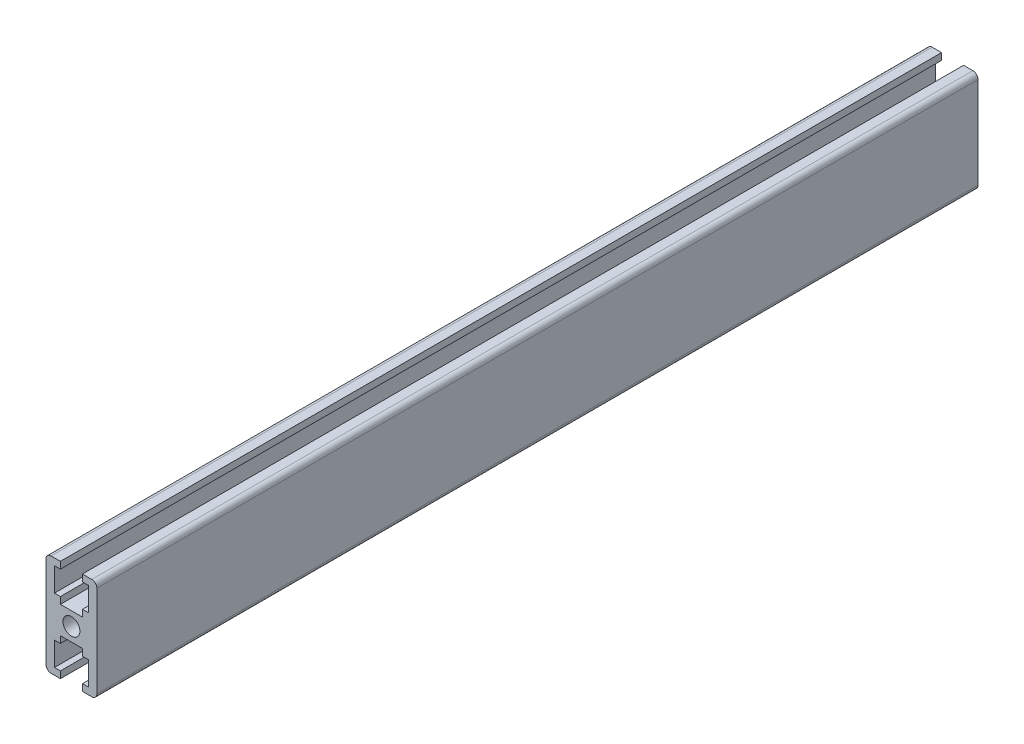
ISO-10303-21;
HEADER;
FILE_DESCRIPTION(('STEP AP214'),'2;1');
FILE_NAME('part.step','',(''),(''),'','','');
FILE_SCHEMA(('AUTOMOTIVE_DESIGN { 1 0 10303 214 1 1 1 1 }'));
ENDSEC;
DATA;
#1=APPLICATION_CONTEXT('core data for automotive mechanical design processes');
#2=APPLICATION_PROTOCOL_DEFINITION('international standard','automotive_design',2000,#1);
#3=PRODUCT_CONTEXT('',#1,'mechanical');
#4=PRODUCT('Part','Part','',(#3));
#5=PRODUCT_RELATED_PRODUCT_CATEGORY('part','',(#4));
#6=PRODUCT_DEFINITION_FORMATION('','',#4);
#7=PRODUCT_DEFINITION_CONTEXT('part definition',#1,'design');
#8=PRODUCT_DEFINITION('design','',#6,#7);
#9=PRODUCT_DEFINITION_SHAPE('','',#8);
#10=(LENGTH_UNIT() NAMED_UNIT(*) SI_UNIT(.MILLI.,.METRE.));
#11=(NAMED_UNIT(*) PLANE_ANGLE_UNIT() SI_UNIT($,.RADIAN.));
#12=(NAMED_UNIT(*) SI_UNIT($,.STERADIAN.) SOLID_ANGLE_UNIT());
#13=UNCERTAINTY_MEASURE_WITH_UNIT(LENGTH_MEASURE(1.E-05),#10,'distance_accuracy_value','');
#14=(GEOMETRIC_REPRESENTATION_CONTEXT(3) GLOBAL_UNCERTAINTY_ASSIGNED_CONTEXT((#13)) GLOBAL_UNIT_ASSIGNED_CONTEXT((#10,
#11,#12)) REPRESENTATION_CONTEXT('',''));
#15=CARTESIAN_POINT('',(0.,0.,0.));
#16=DIRECTION('',(0.,0.,1.));
#17=DIRECTION('',(1.,0.,0.));
#18=AXIS2_PLACEMENT_3D('',#15,#16,#17);
#19=CARTESIAN_POINT('',(6.,13.5,260.));
#20=DIRECTION('',(0.,0.,-1.));
#21=DIRECTION('',(-1.,0.,0.));
#22=AXIS2_PLACEMENT_3D('',#19,#20,#21);
#23=PLANE('',#22);
#24=DIRECTION('',(0.,1.,0.));
#25=VECTOR('',#24,1.);
#26=CARTESIAN_POINT('',(-3.25,15.,260.));
#27=LINE('',#26,#25);
#28=CARTESIAN_POINT('',(-3.25,13.,260.));
#29=VERTEX_POINT('',#28);
#30=CARTESIAN_POINT('',(-3.25,15.,260.));
#31=VERTEX_POINT('',#30);
#32=EDGE_CURVE('E337',#29,#31,#27,.T.);
#33=ORIENTED_EDGE('',*,*,#32,.T.);
#34=DIRECTION('',(-1.,0.,0.));
#35=VECTOR('',#34,1.);
#36=CARTESIAN_POINT('',(-5.99999999999999,15.,260.));
#37=LINE('',#36,#35);
#38=CARTESIAN_POINT('',(-5.99999999999999,15.,260.));
#39=VERTEX_POINT('',#38);
#40=EDGE_CURVE('E165',#31,#39,#37,.T.);
#41=ORIENTED_EDGE('',*,*,#40,.T.);
#42=CARTESIAN_POINT('',(-6.,13.5,260.));
#43=DIRECTION('',(0.,0.,1.));
#44=DIRECTION('',(-1.,0.,0.));
#45=AXIS2_PLACEMENT_3D('',#42,#43,#44);
#46=CIRCLE('',#45,1.5);
#47=CARTESIAN_POINT('',(-7.5,13.5,260.));
#48=VERTEX_POINT('',#47);
#49=EDGE_CURVE('E424',#39,#48,#46,.T.);
#50=ORIENTED_EDGE('',*,*,#49,.T.);
#51=DIRECTION('',(0.,-1.,0.));
#52=VECTOR('',#51,1.);
#53=CARTESIAN_POINT('',(-7.5,-13.5,260.));
#54=LINE('',#53,#52);
#55=CARTESIAN_POINT('',(-7.5,-13.5,260.));
#56=VERTEX_POINT('',#55);
#57=EDGE_CURVE('E443',#48,#56,#54,.T.);
#58=ORIENTED_EDGE('',*,*,#57,.T.);
#59=CARTESIAN_POINT('',(-6.,-13.5,260.));
#60=DIRECTION('',(0.,0.,1.));
#61=DIRECTION('',(-1.,0.,0.));
#62=AXIS2_PLACEMENT_3D('',#59,#60,#61);
#63=CIRCLE('',#62,1.5);
#64=CARTESIAN_POINT('',(-5.99999999999999,-15.,260.));
#65=VERTEX_POINT('',#64);
#66=EDGE_CURVE('E440',#56,#65,#63,.T.);
#67=ORIENTED_EDGE('',*,*,#66,.T.);
#68=DIRECTION('',(1.,0.,0.));
#69=VECTOR('',#68,1.);
#70=CARTESIAN_POINT('',(-5.99999999999999,-15.,260.));
#71=LINE('',#70,#69);
#72=CARTESIAN_POINT('',(-3.25,-15.,260.));
#73=VERTEX_POINT('',#72);
#74=EDGE_CURVE('E442',#65,#73,#71,.T.);
#75=ORIENTED_EDGE('',*,*,#74,.T.);
#76=DIRECTION('',(0.,1.,0.));
#77=VECTOR('',#76,1.);
#78=CARTESIAN_POINT('',(-3.25,-15.,260.));
#79=LINE('',#78,#77);
#80=CARTESIAN_POINT('',(-3.25,-13.,260.));
#81=VERTEX_POINT('',#80);
#82=EDGE_CURVE('E445',#73,#81,#79,.T.);
#83=ORIENTED_EDGE('',*,*,#82,.T.);
#84=DIRECTION('',(-1.,0.,0.));
#85=VECTOR('',#84,1.);
#86=CARTESIAN_POINT('',(-3.25,-13.,260.));
#87=LINE('',#86,#85);
#88=CARTESIAN_POINT('',(-5.,-13.,260.));
#89=VERTEX_POINT('',#88);
#90=EDGE_CURVE('E451',#81,#89,#87,.T.);
#91=ORIENTED_EDGE('',*,*,#90,.T.);
#92=DIRECTION('',(0.,1.,0.));
#93=VECTOR('',#92,1.);
#94=CARTESIAN_POINT('',(-5.,-13.,260.));
#95=LINE('',#94,#93);
#96=CARTESIAN_POINT('',(-5.,-6.,260.));
#97=VERTEX_POINT('',#96);
#98=EDGE_CURVE('E453',#89,#97,#95,.T.);
#99=ORIENTED_EDGE('',*,*,#98,.T.);
#100=DIRECTION('',(1.,0.,0.));
#101=VECTOR('',#100,1.);
#102=CARTESIAN_POINT('',(-5.,-6.,260.));
#103=LINE('',#102,#101);
#104=CARTESIAN_POINT('',(-3.25,-6.,260.));
#105=VERTEX_POINT('',#104);
#106=EDGE_CURVE('E455',#97,#105,#103,.T.);
#107=ORIENTED_EDGE('',*,*,#106,.T.);
#108=DIRECTION('',(0.,1.,0.));
#109=VECTOR('',#108,1.);
#110=CARTESIAN_POINT('',(-3.25,-6.,260.));
#111=LINE('',#110,#109);
#112=CARTESIAN_POINT('',(-3.25,-4.,260.));
#113=VERTEX_POINT('',#112);
#114=EDGE_CURVE('E457',#105,#113,#111,.T.);
#115=ORIENTED_EDGE('',*,*,#114,.T.);
#116=DIRECTION('',(1.,0.,0.));
#117=VECTOR('',#116,1.);
#118=CARTESIAN_POINT('',(-3.25,-4.,260.));
#119=LINE('',#118,#117);
#120=CARTESIAN_POINT('',(3.25,-4.,260.));
#121=VERTEX_POINT('',#120);
#122=EDGE_CURVE('E459',#113,#121,#119,.T.);
#123=ORIENTED_EDGE('',*,*,#122,.T.);
#124=DIRECTION('',(0.,-1.,0.));
#125=VECTOR('',#124,1.);
#126=CARTESIAN_POINT('',(3.25,-6.,260.));
#127=LINE('',#126,#125);
#128=CARTESIAN_POINT('',(3.25,-6.,260.));
#129=VERTEX_POINT('',#128);
#130=EDGE_CURVE('E461',#121,#129,#127,.T.);
#131=ORIENTED_EDGE('',*,*,#130,.T.);
#132=DIRECTION('',(1.,0.,0.));
#133=VECTOR('',#132,1.);
#134=CARTESIAN_POINT('',(5.,-6.,260.));
#135=LINE('',#134,#133);
#136=CARTESIAN_POINT('',(5.,-6.,260.));
#137=VERTEX_POINT('',#136);
#138=EDGE_CURVE('E463',#129,#137,#135,.T.);
#139=ORIENTED_EDGE('',*,*,#138,.T.);
#140=DIRECTION('',(0.,-1.,0.));
#141=VECTOR('',#140,1.);
#142=CARTESIAN_POINT('',(5.,-13.,260.));
#143=LINE('',#142,#141);
#144=CARTESIAN_POINT('',(5.,-13.,260.));
#145=VERTEX_POINT('',#144);
#146=EDGE_CURVE('E465',#137,#145,#143,.T.);
#147=ORIENTED_EDGE('',*,*,#146,.T.);
#148=DIRECTION('',(-1.,0.,0.));
#149=VECTOR('',#148,1.);
#150=CARTESIAN_POINT('',(3.25,-13.,260.));
#151=LINE('',#150,#149);
#152=CARTESIAN_POINT('',(3.25,-13.,260.));
#153=VERTEX_POINT('',#152);
#154=EDGE_CURVE('E467',#145,#153,#151,.T.);
#155=ORIENTED_EDGE('',*,*,#154,.T.);
#156=DIRECTION('',(0.,-1.,0.));
#157=VECTOR('',#156,1.);
#158=CARTESIAN_POINT('',(3.25,-15.,260.));
#159=LINE('',#158,#157);
#160=CARTESIAN_POINT('',(3.25,-15.,260.));
#161=VERTEX_POINT('',#160);
#162=EDGE_CURVE('E469',#153,#161,#159,.T.);
#163=ORIENTED_EDGE('',*,*,#162,.T.);
#164=DIRECTION('',(1.,0.,0.));
#165=VECTOR('',#164,1.);
#166=CARTESIAN_POINT('',(3.25,-15.,260.));
#167=LINE('',#166,#165);
#168=CARTESIAN_POINT('',(5.99999999999999,-15.,260.));
#169=VERTEX_POINT('',#168);
#170=EDGE_CURVE('E471',#161,#169,#167,.T.);
#171=ORIENTED_EDGE('',*,*,#170,.T.);
#172=CARTESIAN_POINT('',(6.,-13.5,260.));
#173=DIRECTION('',(0.,0.,1.));
#174=DIRECTION('',(1.,0.,0.));
#175=AXIS2_PLACEMENT_3D('',#172,#173,#174);
#176=CIRCLE('',#175,1.5);
#177=CARTESIAN_POINT('',(7.5,-13.5,260.));
#178=VERTEX_POINT('',#177);
#179=EDGE_CURVE('E473',#169,#178,#176,.T.);
#180=ORIENTED_EDGE('',*,*,#179,.T.);
#181=DIRECTION('',(0.,1.,0.));
#182=VECTOR('',#181,1.);
#183=CARTESIAN_POINT('',(7.5,-13.5,260.));
#184=LINE('',#183,#182);
#185=CARTESIAN_POINT('',(7.5,13.5,260.));
#186=VERTEX_POINT('',#185);
#187=EDGE_CURVE('E475',#178,#186,#184,.T.);
#188=ORIENTED_EDGE('',*,*,#187,.T.);
#189=CARTESIAN_POINT('',(6.,13.5,260.));
#190=DIRECTION('',(0.,0.,1.));
#191=DIRECTION('',(-1.,0.,0.));
#192=AXIS2_PLACEMENT_3D('',#189,#190,#191);
#193=CIRCLE('',#192,1.5);
#194=CARTESIAN_POINT('',(5.99999999999999,15.,260.));
#195=VERTEX_POINT('',#194);
#196=EDGE_CURVE('E477',#186,#195,#193,.T.);
#197=ORIENTED_EDGE('',*,*,#196,.T.);
#198=DIRECTION('',(-1.,0.,0.));
#199=VECTOR('',#198,1.);
#200=CARTESIAN_POINT('',(3.25,15.,260.));
#201=LINE('',#200,#199);
#202=CARTESIAN_POINT('',(3.25,15.,260.));
#203=VERTEX_POINT('',#202);
#204=EDGE_CURVE('E479',#195,#203,#201,.T.);
#205=ORIENTED_EDGE('',*,*,#204,.T.);
#206=DIRECTION('',(0.,-1.,0.));
#207=VECTOR('',#206,1.);
#208=CARTESIAN_POINT('',(3.25,15.,260.));
#209=LINE('',#208,#207);
#210=CARTESIAN_POINT('',(3.25,13.,260.));
#211=VERTEX_POINT('',#210);
#212=EDGE_CURVE('E481',#203,#211,#209,.T.);
#213=ORIENTED_EDGE('',*,*,#212,.T.);
#214=DIRECTION('',(1.,0.,0.));
#215=VECTOR('',#214,1.);
#216=CARTESIAN_POINT('',(3.25,13.,260.));
#217=LINE('',#216,#215);
#218=CARTESIAN_POINT('',(5.,13.,260.));
#219=VERTEX_POINT('',#218);
#220=EDGE_CURVE('E483',#211,#219,#217,.T.);
#221=ORIENTED_EDGE('',*,*,#220,.T.);
#222=DIRECTION('',(0.,-1.,0.));
#223=VECTOR('',#222,1.);
#224=CARTESIAN_POINT('',(5.,13.,260.));
#225=LINE('',#224,#223);
#226=CARTESIAN_POINT('',(5.,6.,260.));
#227=VERTEX_POINT('',#226);
#228=EDGE_CURVE('E485',#219,#227,#225,.T.);
#229=ORIENTED_EDGE('',*,*,#228,.T.);
#230=DIRECTION('',(-1.,0.,0.));
#231=VECTOR('',#230,1.);
#232=CARTESIAN_POINT('',(5.,6.,260.));
#233=LINE('',#232,#231);
#234=CARTESIAN_POINT('',(3.25,6.,260.));
#235=VERTEX_POINT('',#234);
#236=EDGE_CURVE('E487',#227,#235,#233,.T.);
#237=ORIENTED_EDGE('',*,*,#236,.T.);
#238=DIRECTION('',(0.,-1.,0.));
#239=VECTOR('',#238,1.);
#240=CARTESIAN_POINT('',(3.25,6.,260.));
#241=LINE('',#240,#239);
#242=CARTESIAN_POINT('',(3.25,4.,260.));
#243=VERTEX_POINT('',#242);
#244=EDGE_CURVE('E489',#235,#243,#241,.T.);
#245=ORIENTED_EDGE('',*,*,#244,.T.);
#246=DIRECTION('',(-1.,0.,0.));
#247=VECTOR('',#246,1.);
#248=CARTESIAN_POINT('',(-3.25,4.,260.));
#249=LINE('',#248,#247);
#250=CARTESIAN_POINT('',(-3.25,4.,260.));
#251=VERTEX_POINT('',#250);
#252=EDGE_CURVE('E491',#243,#251,#249,.T.);
#253=ORIENTED_EDGE('',*,*,#252,.T.);
#254=DIRECTION('',(0.,1.,0.));
#255=VECTOR('',#254,1.);
#256=CARTESIAN_POINT('',(-3.25,6.,260.));
#257=LINE('',#256,#255);
#258=CARTESIAN_POINT('',(-3.25,6.,260.));
#259=VERTEX_POINT('',#258);
#260=EDGE_CURVE('E256',#251,#259,#257,.T.);
#261=ORIENTED_EDGE('',*,*,#260,.T.);
#262=DIRECTION('',(-1.,0.,0.));
#263=VECTOR('',#262,1.);
#264=CARTESIAN_POINT('',(-5.,6.,260.));
#265=LINE('',#264,#263);
#266=CARTESIAN_POINT('',(-5.,6.,260.));
#267=VERTEX_POINT('',#266);
#268=EDGE_CURVE('E250',#259,#267,#265,.T.);
#269=ORIENTED_EDGE('',*,*,#268,.T.);
#270=DIRECTION('',(0.,1.,0.));
#271=VECTOR('',#270,1.);
#272=CARTESIAN_POINT('',(-5.,13.,260.));
#273=LINE('',#272,#271);
#274=CARTESIAN_POINT('',(-5.,13.,260.));
#275=VERTEX_POINT('',#274);
#276=EDGE_CURVE('E254',#267,#275,#273,.T.);
#277=ORIENTED_EDGE('',*,*,#276,.T.);
#278=DIRECTION('',(1.,0.,0.));
#279=VECTOR('',#278,1.);
#280=CARTESIAN_POINT('',(-3.25,13.,260.));
#281=LINE('',#280,#279);
#282=EDGE_CURVE('E50',#275,#29,#281,.T.);
#283=ORIENTED_EDGE('',*,*,#282,.T.);
#284=EDGE_LOOP('',(#33,#41,#50,#58,#67,#75,#83,#91,#99,#107,#115,#123,#131,#139,#147,#155,#163,
#171,#180,#188,#197,#205,#213,#221,#229,#237,#245,#253,#261,#269,#277,#283));
#285=FACE_BOUND('',#284,.T.);
#286=CARTESIAN_POINT('',(0.,0.,260.));
#287=DIRECTION('',(0.,0.,1.));
#288=DIRECTION('',(1.,0.,0.));
#289=AXIS2_PLACEMENT_3D('',#286,#287,#288);
#290=CIRCLE('',#289,2.5);
#291=CARTESIAN_POINT('',(2.5,0.,260.));
#292=VERTEX_POINT('',#291);
#293=EDGE_CURVE('E278',#292,#292,#290,.T.);
#294=ORIENTED_EDGE('',*,*,#293,.F.);
#295=EDGE_LOOP('',(#294));
#296=FACE_BOUND('',#295,.T.);
#297=ADVANCED_FACE('F33',(#285,#296),#23,.F.);
#298=CARTESIAN_POINT('',(6.,13.5,0.));
#299=DIRECTION('',(0.,0.,-1.));
#300=DIRECTION('',(-1.,0.,0.));
#301=AXIS2_PLACEMENT_3D('',#298,#299,#300);
#302=PLANE('',#301);
#303=DIRECTION('',(0.,1.,0.));
#304=VECTOR('',#303,1.);
#305=CARTESIAN_POINT('',(-3.25,15.,0.));
#306=LINE('',#305,#304);
#307=CARTESIAN_POINT('',(-3.25,13.,0.));
#308=VERTEX_POINT('',#307);
#309=CARTESIAN_POINT('',(-3.25,15.,0.));
#310=VERTEX_POINT('',#309);
#311=EDGE_CURVE('E274',#308,#310,#306,.T.);
#312=ORIENTED_EDGE('',*,*,#311,.F.);
#313=DIRECTION('',(1.,0.,0.));
#314=VECTOR('',#313,1.);
#315=CARTESIAN_POINT('',(-3.25,13.,0.));
#316=LINE('',#315,#314);
#317=CARTESIAN_POINT('',(-5.,13.,0.));
#318=VERTEX_POINT('',#317);
#319=EDGE_CURVE('E157',#318,#308,#316,.T.);
#320=ORIENTED_EDGE('',*,*,#319,.F.);
#321=DIRECTION('',(0.,1.,0.));
#322=VECTOR('',#321,1.);
#323=CARTESIAN_POINT('',(-5.,13.,0.));
#324=LINE('',#323,#322);
#325=CARTESIAN_POINT('',(-5.,6.,0.));
#326=VERTEX_POINT('',#325);
#327=EDGE_CURVE('E151',#326,#318,#324,.T.);
#328=ORIENTED_EDGE('',*,*,#327,.F.);
#329=DIRECTION('',(-1.,0.,0.));
#330=VECTOR('',#329,1.);
#331=CARTESIAN_POINT('',(-5.,6.,0.));
#332=LINE('',#331,#330);
#333=CARTESIAN_POINT('',(-3.25,6.,0.));
#334=VERTEX_POINT('',#333);
#335=EDGE_CURVE('E264',#334,#326,#332,.T.);
#336=ORIENTED_EDGE('',*,*,#335,.F.);
#337=DIRECTION('',(0.,1.,0.));
#338=VECTOR('',#337,1.);
#339=CARTESIAN_POINT('',(-3.25,6.,0.));
#340=LINE('',#339,#338);
#341=CARTESIAN_POINT('',(-3.25,4.,0.));
#342=VERTEX_POINT('',#341);
#343=EDGE_CURVE('E332',#342,#334,#340,.T.);
#344=ORIENTED_EDGE('',*,*,#343,.F.);
#345=DIRECTION('',(-1.,0.,0.));
#346=VECTOR('',#345,1.);
#347=CARTESIAN_POINT('',(-3.25,4.,0.));
#348=LINE('',#347,#346);
#349=CARTESIAN_POINT('',(3.25,4.,0.));
#350=VERTEX_POINT('',#349);
#351=EDGE_CURVE('E330',#350,#342,#348,.T.);
#352=ORIENTED_EDGE('',*,*,#351,.F.);
#353=DIRECTION('',(0.,-1.,0.));
#354=VECTOR('',#353,1.);
#355=CARTESIAN_POINT('',(3.25,6.,0.));
#356=LINE('',#355,#354);
#357=CARTESIAN_POINT('',(3.25,6.,0.));
#358=VERTEX_POINT('',#357);
#359=EDGE_CURVE('E328',#358,#350,#356,.T.);
#360=ORIENTED_EDGE('',*,*,#359,.F.);
#361=DIRECTION('',(-1.,0.,0.));
#362=VECTOR('',#361,1.);
#363=CARTESIAN_POINT('',(5.,6.,0.));
#364=LINE('',#363,#362);
#365=CARTESIAN_POINT('',(5.,6.,0.));
#366=VERTEX_POINT('',#365);
#367=EDGE_CURVE('E326',#366,#358,#364,.T.);
#368=ORIENTED_EDGE('',*,*,#367,.F.);
#369=DIRECTION('',(0.,-1.,0.));
#370=VECTOR('',#369,1.);
#371=CARTESIAN_POINT('',(5.,13.,0.));
#372=LINE('',#371,#370);
#373=CARTESIAN_POINT('',(5.,13.,0.));
#374=VERTEX_POINT('',#373);
#375=EDGE_CURVE('E324',#374,#366,#372,.T.);
#376=ORIENTED_EDGE('',*,*,#375,.F.);
#377=DIRECTION('',(1.,0.,0.));
#378=VECTOR('',#377,1.);
#379=CARTESIAN_POINT('',(3.25,13.,0.));
#380=LINE('',#379,#378);
#381=CARTESIAN_POINT('',(3.25,13.,0.));
#382=VERTEX_POINT('',#381);
#383=EDGE_CURVE('E322',#382,#374,#380,.T.);
#384=ORIENTED_EDGE('',*,*,#383,.F.);
#385=DIRECTION('',(0.,-1.,0.));
#386=VECTOR('',#385,1.);
#387=CARTESIAN_POINT('',(3.25,15.,0.));
#388=LINE('',#387,#386);
#389=CARTESIAN_POINT('',(3.25,15.,0.));
#390=VERTEX_POINT('',#389);
#391=EDGE_CURVE('E320',#390,#382,#388,.T.);
#392=ORIENTED_EDGE('',*,*,#391,.F.);
#393=DIRECTION('',(-1.,0.,0.));
#394=VECTOR('',#393,1.);
#395=CARTESIAN_POINT('',(3.25,15.,0.));
#396=LINE('',#395,#394);
#397=CARTESIAN_POINT('',(5.99999999999999,15.,0.));
#398=VERTEX_POINT('',#397);
#399=EDGE_CURVE('E318',#398,#390,#396,.T.);
#400=ORIENTED_EDGE('',*,*,#399,.F.);
#401=CARTESIAN_POINT('',(6.,13.5,0.));
#402=DIRECTION('',(0.,0.,1.));
#403=DIRECTION('',(-1.,0.,0.));
#404=AXIS2_PLACEMENT_3D('',#401,#402,#403);
#405=CIRCLE('',#404,1.5);
#406=CARTESIAN_POINT('',(7.5,13.5,0.));
#407=VERTEX_POINT('',#406);
#408=EDGE_CURVE('E316',#407,#398,#405,.T.);
#409=ORIENTED_EDGE('',*,*,#408,.F.);
#410=DIRECTION('',(0.,1.,0.));
#411=VECTOR('',#410,1.);
#412=CARTESIAN_POINT('',(7.5,-13.5,0.));
#413=LINE('',#412,#411);
#414=CARTESIAN_POINT('',(7.5,-13.5,0.));
#415=VERTEX_POINT('',#414);
#416=EDGE_CURVE('E314',#415,#407,#413,.T.);
#417=ORIENTED_EDGE('',*,*,#416,.F.);
#418=CARTESIAN_POINT('',(6.,-13.5,0.));
#419=DIRECTION('',(0.,0.,1.));
#420=DIRECTION('',(1.,0.,0.));
#421=AXIS2_PLACEMENT_3D('',#418,#419,#420);
#422=CIRCLE('',#421,1.5);
#423=CARTESIAN_POINT('',(5.99999999999999,-15.,0.));
#424=VERTEX_POINT('',#423);
#425=EDGE_CURVE('E312',#424,#415,#422,.T.);
#426=ORIENTED_EDGE('',*,*,#425,.F.);
#427=DIRECTION('',(1.,0.,0.));
#428=VECTOR('',#427,1.);
#429=CARTESIAN_POINT('',(3.25,-15.,0.));
#430=LINE('',#429,#428);
#431=CARTESIAN_POINT('',(3.25,-15.,0.));
#432=VERTEX_POINT('',#431);
#433=EDGE_CURVE('E310',#432,#424,#430,.T.);
#434=ORIENTED_EDGE('',*,*,#433,.F.);
#435=DIRECTION('',(0.,-1.,0.));
#436=VECTOR('',#435,1.);
#437=CARTESIAN_POINT('',(3.25,-15.,0.));
#438=LINE('',#437,#436);
#439=CARTESIAN_POINT('',(3.25,-13.,0.));
#440=VERTEX_POINT('',#439);
#441=EDGE_CURVE('E308',#440,#432,#438,.T.);
#442=ORIENTED_EDGE('',*,*,#441,.F.);
#443=DIRECTION('',(-1.,0.,0.));
#444=VECTOR('',#443,1.);
#445=CARTESIAN_POINT('',(3.25,-13.,0.));
#446=LINE('',#445,#444);
#447=CARTESIAN_POINT('',(5.,-13.,0.));
#448=VERTEX_POINT('',#447);
#449=EDGE_CURVE('E306',#448,#440,#446,.T.);
#450=ORIENTED_EDGE('',*,*,#449,.F.);
#451=DIRECTION('',(0.,-1.,0.));
#452=VECTOR('',#451,1.);
#453=CARTESIAN_POINT('',(5.,-13.,0.));
#454=LINE('',#453,#452);
#455=CARTESIAN_POINT('',(5.,-6.,0.));
#456=VERTEX_POINT('',#455);
#457=EDGE_CURVE('E304',#456,#448,#454,.T.);
#458=ORIENTED_EDGE('',*,*,#457,.F.);
#459=DIRECTION('',(1.,0.,0.));
#460=VECTOR('',#459,1.);
#461=CARTESIAN_POINT('',(5.,-6.,0.));
#462=LINE('',#461,#460);
#463=CARTESIAN_POINT('',(3.25,-6.,0.));
#464=VERTEX_POINT('',#463);
#465=EDGE_CURVE('E302',#464,#456,#462,.T.);
#466=ORIENTED_EDGE('',*,*,#465,.F.);
#467=DIRECTION('',(0.,-1.,0.));
#468=VECTOR('',#467,1.);
#469=CARTESIAN_POINT('',(3.25,-6.,0.));
#470=LINE('',#469,#468);
#471=CARTESIAN_POINT('',(3.25,-4.,0.));
#472=VERTEX_POINT('',#471);
#473=EDGE_CURVE('E300',#472,#464,#470,.T.);
#474=ORIENTED_EDGE('',*,*,#473,.F.);
#475=DIRECTION('',(1.,0.,0.));
#476=VECTOR('',#475,1.);
#477=CARTESIAN_POINT('',(-3.25,-4.,0.));
#478=LINE('',#477,#476);
#479=CARTESIAN_POINT('',(-3.25,-4.,0.));
#480=VERTEX_POINT('',#479);
#481=EDGE_CURVE('E298',#480,#472,#478,.T.);
#482=ORIENTED_EDGE('',*,*,#481,.F.);
#483=DIRECTION('',(0.,1.,0.));
#484=VECTOR('',#483,1.);
#485=CARTESIAN_POINT('',(-3.25,-6.,0.));
#486=LINE('',#485,#484);
#487=CARTESIAN_POINT('',(-3.25,-6.,0.));
#488=VERTEX_POINT('',#487);
#489=EDGE_CURVE('E296',#488,#480,#486,.T.);
#490=ORIENTED_EDGE('',*,*,#489,.F.);
#491=DIRECTION('',(1.,0.,0.));
#492=VECTOR('',#491,1.);
#493=CARTESIAN_POINT('',(-5.,-6.,0.));
#494=LINE('',#493,#492);
#495=CARTESIAN_POINT('',(-5.,-6.,0.));
#496=VERTEX_POINT('',#495);
#497=EDGE_CURVE('E294',#496,#488,#494,.T.);
#498=ORIENTED_EDGE('',*,*,#497,.F.);
#499=DIRECTION('',(0.,1.,0.));
#500=VECTOR('',#499,1.);
#501=CARTESIAN_POINT('',(-5.,-13.,0.));
#502=LINE('',#501,#500);
#503=CARTESIAN_POINT('',(-5.,-13.,0.));
#504=VERTEX_POINT('',#503);
#505=EDGE_CURVE('E292',#504,#496,#502,.T.);
#506=ORIENTED_EDGE('',*,*,#505,.F.);
#507=DIRECTION('',(-1.,0.,0.));
#508=VECTOR('',#507,1.);
#509=CARTESIAN_POINT('',(-3.25,-13.,0.));
#510=LINE('',#509,#508);
#511=CARTESIAN_POINT('',(-3.25,-13.,0.));
#512=VERTEX_POINT('',#511);
#513=EDGE_CURVE('E290',#512,#504,#510,.T.);
#514=ORIENTED_EDGE('',*,*,#513,.F.);
#515=DIRECTION('',(0.,1.,0.));
#516=VECTOR('',#515,1.);
#517=CARTESIAN_POINT('',(-3.25,-15.,0.));
#518=LINE('',#517,#516);
#519=CARTESIAN_POINT('',(-3.25,-15.,0.));
#520=VERTEX_POINT('',#519);
#521=EDGE_CURVE('E288',#520,#512,#518,.T.);
#522=ORIENTED_EDGE('',*,*,#521,.F.);
#523=DIRECTION('',(1.,0.,0.));
#524=VECTOR('',#523,1.);
#525=CARTESIAN_POINT('',(-5.99999999999999,-15.,0.));
#526=LINE('',#525,#524);
#527=CARTESIAN_POINT('',(-5.99999999999999,-15.,0.));
#528=VERTEX_POINT('',#527);
#529=EDGE_CURVE('E286',#528,#520,#526,.T.);
#530=ORIENTED_EDGE('',*,*,#529,.F.);
#531=CARTESIAN_POINT('',(-6.,-13.5,0.));
#532=DIRECTION('',(0.,0.,1.));
#533=DIRECTION('',(-1.,0.,0.));
#534=AXIS2_PLACEMENT_3D('',#531,#532,#533);
#535=CIRCLE('',#534,1.5);
#536=CARTESIAN_POINT('',(-7.5,-13.5,0.));
#537=VERTEX_POINT('',#536);
#538=EDGE_CURVE('E284',#537,#528,#535,.T.);
#539=ORIENTED_EDGE('',*,*,#538,.F.);
#540=DIRECTION('',(0.,-1.,0.));
#541=VECTOR('',#540,1.);
#542=CARTESIAN_POINT('',(-7.5,-13.5,0.));
#543=LINE('',#542,#541);
#544=CARTESIAN_POINT('',(-7.5,13.5,0.));
#545=VERTEX_POINT('',#544);
#546=EDGE_CURVE('E282',#545,#537,#543,.T.);
#547=ORIENTED_EDGE('',*,*,#546,.F.);
#548=CARTESIAN_POINT('',(-6.,13.5,0.));
#549=DIRECTION('',(0.,0.,1.));
#550=DIRECTION('',(-1.,0.,0.));
#551=AXIS2_PLACEMENT_3D('',#548,#549,#550);
#552=CIRCLE('',#551,1.5);
#553=CARTESIAN_POINT('',(-5.99999999999999,15.,0.));
#554=VERTEX_POINT('',#553);
#555=EDGE_CURVE('E280',#554,#545,#552,.T.);
#556=ORIENTED_EDGE('',*,*,#555,.F.);
#557=DIRECTION('',(-1.,0.,0.));
#558=VECTOR('',#557,1.);
#559=CARTESIAN_POINT('',(-5.99999999999999,15.,0.));
#560=LINE('',#559,#558);
#561=EDGE_CURVE('E277',#310,#554,#560,.T.);
#562=ORIENTED_EDGE('',*,*,#561,.F.);
#563=EDGE_LOOP('',(#312,#320,#328,#336,#344,#352,#360,#368,#376,#384,#392,#400,#409,#417,#426,
#434,#442,#450,#458,#466,#474,#482,#490,#498,#506,#514,#522,#530,#539,#547,#556,#562));
#564=FACE_BOUND('',#563,.T.);
#565=CARTESIAN_POINT('',(0.,0.,0.));
#566=DIRECTION('',(0.,0.,1.));
#567=DIRECTION('',(1.,0.,0.));
#568=AXIS2_PLACEMENT_3D('',#565,#566,#567);
#569=CIRCLE('',#568,2.5);
#570=CARTESIAN_POINT('',(2.5,0.,0.));
#571=VERTEX_POINT('',#570);
#572=EDGE_CURVE('E896',#571,#571,#569,.T.);
#573=ORIENTED_EDGE('',*,*,#572,.T.);
#574=EDGE_LOOP('',(#573));
#575=FACE_BOUND('',#574,.T.);
#576=ADVANCED_FACE('F428',(#564,#575),#302,.T.);
#577=CARTESIAN_POINT('',(-3.25,15.,260.));
#578=DIRECTION('',(-1.,0.,0.));
#579=DIRECTION('',(0.,-1.,0.));
#580=AXIS2_PLACEMENT_3D('',#577,#578,#579);
#581=PLANE('',#580);
#582=ORIENTED_EDGE('',*,*,#311,.T.);
#583=DIRECTION('',(0.,0.,-1.));
#584=VECTOR('',#583,1.);
#585=CARTESIAN_POINT('',(-3.25,15.,260.));
#586=LINE('',#585,#584);
#587=EDGE_CURVE('E11',#31,#310,#586,.T.);
#588=ORIENTED_EDGE('',*,*,#587,.F.);
#589=ORIENTED_EDGE('',*,*,#32,.F.);
#590=DIRECTION('',(0.,0.,-1.));
#591=VECTOR('',#590,1.);
#592=CARTESIAN_POINT('',(-3.25,13.,260.));
#593=LINE('',#592,#591);
#594=EDGE_CURVE('E270',#29,#308,#593,.T.);
#595=ORIENTED_EDGE('',*,*,#594,.T.);
#596=EDGE_LOOP('',(#582,#588,#589,#595));
#597=FACE_BOUND('',#596,.T.);
#598=ADVANCED_FACE('F35',(#597),#581,.F.);
#599=CARTESIAN_POINT('',(-5.99999999999999,15.,260.));
#600=DIRECTION('',(0.,-1.,0.));
#601=DIRECTION('',(1.,0.,0.));
#602=AXIS2_PLACEMENT_3D('',#599,#600,#601);
#603=PLANE('',#602);
#604=ORIENTED_EDGE('',*,*,#561,.T.);
#605=DIRECTION('',(0.,0.,-1.));
#606=VECTOR('',#605,1.);
#607=CARTESIAN_POINT('',(-5.99999999999999,15.,260.));
#608=LINE('',#607,#606);
#609=EDGE_CURVE('E42',#39,#554,#608,.T.);
#610=ORIENTED_EDGE('',*,*,#609,.F.);
#611=ORIENTED_EDGE('',*,*,#40,.F.);
#612=ORIENTED_EDGE('',*,*,#587,.T.);
#613=EDGE_LOOP('',(#604,#610,#611,#612));
#614=FACE_BOUND('',#613,.T.);
#615=ADVANCED_FACE('F526',(#614),#603,.F.);
#616=CARTESIAN_POINT('',(-6.,13.5,260.));
#617=DIRECTION('',(0.,0.,-1.));
#618=DIRECTION('',(-1.,0.,0.));
#619=AXIS2_PLACEMENT_3D('',#616,#617,#618);
#620=CYLINDRICAL_SURFACE('',#619,1.5);
#621=ORIENTED_EDGE('',*,*,#555,.T.);
#622=DIRECTION('',(0.,0.,-1.));
#623=VECTOR('',#622,1.);
#624=CARTESIAN_POINT('',(-7.5,13.5,260.));
#625=LINE('',#624,#623);
#626=EDGE_CURVE('E416',#48,#545,#625,.T.);
#627=ORIENTED_EDGE('',*,*,#626,.F.);
#628=ORIENTED_EDGE('',*,*,#49,.F.);
#629=ORIENTED_EDGE('',*,*,#609,.T.);
#630=EDGE_LOOP('',(#621,#627,#628,#629));
#631=FACE_BOUND('',#630,.T.);
#632=ADVANCED_FACE('F422',(#631),#620,.T.);
#633=CARTESIAN_POINT('',(-7.5,-13.5,260.));
#634=DIRECTION('',(1.,0.,0.));
#635=DIRECTION('',(0.,0.,-1.));
#636=AXIS2_PLACEMENT_3D('',#633,#634,#635);
#637=PLANE('',#636);
#638=ORIENTED_EDGE('',*,*,#546,.T.);
#639=DIRECTION('',(0.,0.,-1.));
#640=VECTOR('',#639,1.);
#641=CARTESIAN_POINT('',(-7.5,-13.5,260.));
#642=LINE('',#641,#640);
#643=EDGE_CURVE('E413',#56,#537,#642,.T.);
#644=ORIENTED_EDGE('',*,*,#643,.F.);
#645=ORIENTED_EDGE('',*,*,#57,.F.);
#646=ORIENTED_EDGE('',*,*,#626,.T.);
#647=EDGE_LOOP('',(#638,#644,#645,#646));
#648=FACE_BOUND('',#647,.T.);
#649=ADVANCED_FACE('F434',(#648),#637,.F.);
#650=CARTESIAN_POINT('',(-6.,-13.5,260.));
#651=DIRECTION('',(0.,0.,-1.));
#652=DIRECTION('',(-1.,0.,0.));
#653=AXIS2_PLACEMENT_3D('',#650,#651,#652);
#654=CYLINDRICAL_SURFACE('',#653,1.5);
#655=ORIENTED_EDGE('',*,*,#538,.T.);
#656=DIRECTION('',(0.,0.,-1.));
#657=VECTOR('',#656,1.);
#658=CARTESIAN_POINT('',(-5.99999999999999,-15.,260.));
#659=LINE('',#658,#657);
#660=EDGE_CURVE('E410',#65,#528,#659,.T.);
#661=ORIENTED_EDGE('',*,*,#660,.F.);
#662=ORIENTED_EDGE('',*,*,#66,.F.);
#663=ORIENTED_EDGE('',*,*,#643,.T.);
#664=EDGE_LOOP('',(#655,#661,#662,#663));
#665=FACE_BOUND('',#664,.T.);
#666=ADVANCED_FACE('F438',(#665),#654,.T.);
#667=CARTESIAN_POINT('',(-5.99999999999999,-15.,260.));
#668=DIRECTION('',(0.,1.,0.));
#669=DIRECTION('',(-1.,0.,0.));
#670=AXIS2_PLACEMENT_3D('',#667,#668,#669);
#671=PLANE('',#670);
#672=ORIENTED_EDGE('',*,*,#529,.T.);
#673=DIRECTION('',(0.,0.,-1.));
#674=VECTOR('',#673,1.);
#675=CARTESIAN_POINT('',(-3.25,-15.,260.));
#676=LINE('',#675,#674);
#677=EDGE_CURVE('E407',#73,#520,#676,.T.);
#678=ORIENTED_EDGE('',*,*,#677,.F.);
#679=ORIENTED_EDGE('',*,*,#74,.F.);
#680=ORIENTED_EDGE('',*,*,#660,.T.);
#681=EDGE_LOOP('',(#672,#678,#679,#680));
#682=FACE_BOUND('',#681,.T.);
#683=ADVANCED_FACE('F539',(#682),#671,.F.);
#684=CARTESIAN_POINT('',(-3.25,-15.,260.));
#685=DIRECTION('',(-1.,0.,0.));
#686=DIRECTION('',(0.,-1.,0.));
#687=AXIS2_PLACEMENT_3D('',#684,#685,#686);
#688=PLANE('',#687);
#689=ORIENTED_EDGE('',*,*,#521,.T.);
#690=DIRECTION('',(0.,0.,-1.));
#691=VECTOR('',#690,1.);
#692=CARTESIAN_POINT('',(-3.25,-13.,260.));
#693=LINE('',#692,#691);
#694=EDGE_CURVE('E404',#81,#512,#693,.T.);
#695=ORIENTED_EDGE('',*,*,#694,.F.);
#696=ORIENTED_EDGE('',*,*,#82,.F.);
#697=ORIENTED_EDGE('',*,*,#677,.T.);
#698=EDGE_LOOP('',(#689,#695,#696,#697));
#699=FACE_BOUND('',#698,.T.);
#700=ADVANCED_FACE('F542',(#699),#688,.F.);
#701=CARTESIAN_POINT('',(-3.25,-13.,260.));
#702=DIRECTION('',(0.,-1.,0.));
#703=DIRECTION('',(0.,0.,-1.));
#704=AXIS2_PLACEMENT_3D('',#701,#702,#703);
#705=PLANE('',#704);
#706=ORIENTED_EDGE('',*,*,#513,.T.);
#707=DIRECTION('',(0.,0.,-1.));
#708=VECTOR('',#707,1.);
#709=CARTESIAN_POINT('',(-5.,-13.,260.));
#710=LINE('',#709,#708);
#711=EDGE_CURVE('E401',#89,#504,#710,.T.);
#712=ORIENTED_EDGE('',*,*,#711,.F.);
#713=ORIENTED_EDGE('',*,*,#90,.F.);
#714=ORIENTED_EDGE('',*,*,#694,.T.);
#715=EDGE_LOOP('',(#706,#712,#713,#714));
#716=FACE_BOUND('',#715,.T.);
#717=ADVANCED_FACE('F546',(#716),#705,.F.);
#718=CARTESIAN_POINT('',(-5.,-13.,260.));
#719=DIRECTION('',(-1.,0.,0.));
#720=DIRECTION('',(0.,-1.,0.));
#721=AXIS2_PLACEMENT_3D('',#718,#719,#720);
#722=PLANE('',#721);
#723=ORIENTED_EDGE('',*,*,#505,.T.);
#724=DIRECTION('',(0.,0.,-1.));
#725=VECTOR('',#724,1.);
#726=CARTESIAN_POINT('',(-5.,-6.,260.));
#727=LINE('',#726,#725);
#728=EDGE_CURVE('E398',#97,#496,#727,.T.);
#729=ORIENTED_EDGE('',*,*,#728,.F.);
#730=ORIENTED_EDGE('',*,*,#98,.F.);
#731=ORIENTED_EDGE('',*,*,#711,.T.);
#732=EDGE_LOOP('',(#723,#729,#730,#731));
#733=FACE_BOUND('',#732,.T.);
#734=ADVANCED_FACE('F550',(#733),#722,.F.);
#735=CARTESIAN_POINT('',(-5.,-6.,260.));
#736=DIRECTION('',(0.,1.,0.));
#737=DIRECTION('',(0.,0.,1.));
#738=AXIS2_PLACEMENT_3D('',#735,#736,#737);
#739=PLANE('',#738);
#740=ORIENTED_EDGE('',*,*,#497,.T.);
#741=DIRECTION('',(0.,0.,-1.));
#742=VECTOR('',#741,1.);
#743=CARTESIAN_POINT('',(-3.25,-6.,260.));
#744=LINE('',#743,#742);
#745=EDGE_CURVE('E395',#105,#488,#744,.T.);
#746=ORIENTED_EDGE('',*,*,#745,.F.);
#747=ORIENTED_EDGE('',*,*,#106,.F.);
#748=ORIENTED_EDGE('',*,*,#728,.T.);
#749=EDGE_LOOP('',(#740,#746,#747,#748));
#750=FACE_BOUND('',#749,.T.);
#751=ADVANCED_FACE('F554',(#750),#739,.F.);
#752=CARTESIAN_POINT('',(-3.25,-6.,260.));
#753=DIRECTION('',(-1.,0.,0.));
#754=DIRECTION('',(0.,0.,1.));
#755=AXIS2_PLACEMENT_3D('',#752,#753,#754);
#756=PLANE('',#755);
#757=ORIENTED_EDGE('',*,*,#489,.T.);
#758=DIRECTION('',(0.,0.,-1.));
#759=VECTOR('',#758,1.);
#760=CARTESIAN_POINT('',(-3.25,-4.,260.));
#761=LINE('',#760,#759);
#762=EDGE_CURVE('E392',#113,#480,#761,.T.);
#763=ORIENTED_EDGE('',*,*,#762,.F.);
#764=ORIENTED_EDGE('',*,*,#114,.F.);
#765=ORIENTED_EDGE('',*,*,#745,.T.);
#766=EDGE_LOOP('',(#757,#763,#764,#765));
#767=FACE_BOUND('',#766,.T.);
#768=ADVANCED_FACE('F558',(#767),#756,.F.);
#769=CARTESIAN_POINT('',(-3.25,-4.,260.));
#770=DIRECTION('',(0.,1.,0.));
#771=DIRECTION('',(-1.,0.,0.));
#772=AXIS2_PLACEMENT_3D('',#769,#770,#771);
#773=PLANE('',#772);
#774=ORIENTED_EDGE('',*,*,#481,.T.);
#775=DIRECTION('',(0.,0.,-1.));
#776=VECTOR('',#775,1.);
#777=CARTESIAN_POINT('',(3.25,-4.,260.));
#778=LINE('',#777,#776);
#779=EDGE_CURVE('E389',#121,#472,#778,.T.);
#780=ORIENTED_EDGE('',*,*,#779,.F.);
#781=ORIENTED_EDGE('',*,*,#122,.F.);
#782=ORIENTED_EDGE('',*,*,#762,.T.);
#783=EDGE_LOOP('',(#774,#780,#781,#782));
#784=FACE_BOUND('',#783,.T.);
#785=ADVANCED_FACE('F562',(#784),#773,.F.);
#786=CARTESIAN_POINT('',(3.25,-6.,260.));
#787=DIRECTION('',(1.,0.,0.));
#788=DIRECTION('',(0.,0.,-1.));
#789=AXIS2_PLACEMENT_3D('',#786,#787,#788);
#790=PLANE('',#789);
#791=ORIENTED_EDGE('',*,*,#473,.T.);
#792=DIRECTION('',(0.,0.,-1.));
#793=VECTOR('',#792,1.);
#794=CARTESIAN_POINT('',(3.25,-6.,260.));
#795=LINE('',#794,#793);
#796=EDGE_CURVE('E386',#129,#464,#795,.T.);
#797=ORIENTED_EDGE('',*,*,#796,.F.);
#798=ORIENTED_EDGE('',*,*,#130,.F.);
#799=ORIENTED_EDGE('',*,*,#779,.T.);
#800=EDGE_LOOP('',(#791,#797,#798,#799));
#801=FACE_BOUND('',#800,.T.);
#802=ADVANCED_FACE('F566',(#801),#790,.F.);
#803=CARTESIAN_POINT('',(5.,-6.,260.));
#804=DIRECTION('',(0.,1.,0.));
#805=DIRECTION('',(0.,0.,1.));
#806=AXIS2_PLACEMENT_3D('',#803,#804,#805);
#807=PLANE('',#806);
#808=ORIENTED_EDGE('',*,*,#465,.T.);
#809=DIRECTION('',(0.,0.,-1.));
#810=VECTOR('',#809,1.);
#811=CARTESIAN_POINT('',(5.,-6.,260.));
#812=LINE('',#811,#810);
#813=EDGE_CURVE('E383',#137,#456,#812,.T.);
#814=ORIENTED_EDGE('',*,*,#813,.F.);
#815=ORIENTED_EDGE('',*,*,#138,.F.);
#816=ORIENTED_EDGE('',*,*,#796,.T.);
#817=EDGE_LOOP('',(#808,#814,#815,#816));
#818=FACE_BOUND('',#817,.T.);
#819=ADVANCED_FACE('F570',(#818),#807,.F.);
#820=CARTESIAN_POINT('',(5.,-13.,260.));
#821=DIRECTION('',(1.,0.,0.));
#822=DIRECTION('',(0.,0.,-1.));
#823=AXIS2_PLACEMENT_3D('',#820,#821,#822);
#824=PLANE('',#823);
#825=ORIENTED_EDGE('',*,*,#457,.T.);
#826=DIRECTION('',(0.,0.,-1.));
#827=VECTOR('',#826,1.);
#828=CARTESIAN_POINT('',(5.,-13.,260.));
#829=LINE('',#828,#827);
#830=EDGE_CURVE('E380',#145,#448,#829,.T.);
#831=ORIENTED_EDGE('',*,*,#830,.F.);
#832=ORIENTED_EDGE('',*,*,#146,.F.);
#833=ORIENTED_EDGE('',*,*,#813,.T.);
#834=EDGE_LOOP('',(#825,#831,#832,#833));
#835=FACE_BOUND('',#834,.T.);
#836=ADVANCED_FACE('F574',(#835),#824,.F.);
#837=CARTESIAN_POINT('',(3.25,-13.,260.));
#838=DIRECTION('',(0.,-1.,0.));
#839=DIRECTION('',(1.,0.,0.));
#840=AXIS2_PLACEMENT_3D('',#837,#838,#839);
#841=PLANE('',#840);
#842=ORIENTED_EDGE('',*,*,#449,.T.);
#843=DIRECTION('',(0.,0.,-1.));
#844=VECTOR('',#843,1.);
#845=CARTESIAN_POINT('',(3.25,-13.,260.));
#846=LINE('',#845,#844);
#847=EDGE_CURVE('E377',#153,#440,#846,.T.);
#848=ORIENTED_EDGE('',*,*,#847,.F.);
#849=ORIENTED_EDGE('',*,*,#154,.F.);
#850=ORIENTED_EDGE('',*,*,#830,.T.);
#851=EDGE_LOOP('',(#842,#848,#849,#850));
#852=FACE_BOUND('',#851,.T.);
#853=ADVANCED_FACE('F578',(#852),#841,.F.);
#854=CARTESIAN_POINT('',(3.25,-15.,260.));
#855=DIRECTION('',(1.,0.,0.));
#856=DIRECTION('',(0.,0.,-1.));
#857=AXIS2_PLACEMENT_3D('',#854,#855,#856);
#858=PLANE('',#857);
#859=ORIENTED_EDGE('',*,*,#441,.T.);
#860=DIRECTION('',(0.,0.,-1.));
#861=VECTOR('',#860,1.);
#862=CARTESIAN_POINT('',(3.25,-15.,260.));
#863=LINE('',#862,#861);
#864=EDGE_CURVE('E374',#161,#432,#863,.T.);
#865=ORIENTED_EDGE('',*,*,#864,.F.);
#866=ORIENTED_EDGE('',*,*,#162,.F.);
#867=ORIENTED_EDGE('',*,*,#847,.T.);
#868=EDGE_LOOP('',(#859,#865,#866,#867));
#869=FACE_BOUND('',#868,.T.);
#870=ADVANCED_FACE('F582',(#869),#858,.F.);
#871=CARTESIAN_POINT('',(3.25,-15.,260.));
#872=DIRECTION('',(0.,1.,0.));
#873=DIRECTION('',(-1.,0.,0.));
#874=AXIS2_PLACEMENT_3D('',#871,#872,#873);
#875=PLANE('',#874);
#876=ORIENTED_EDGE('',*,*,#433,.T.);
#877=DIRECTION('',(0.,0.,-1.));
#878=VECTOR('',#877,1.);
#879=CARTESIAN_POINT('',(5.99999999999999,-15.,260.));
#880=LINE('',#879,#878);
#881=EDGE_CURVE('E371',#169,#424,#880,.T.);
#882=ORIENTED_EDGE('',*,*,#881,.F.);
#883=ORIENTED_EDGE('',*,*,#170,.F.);
#884=ORIENTED_EDGE('',*,*,#864,.T.);
#885=EDGE_LOOP('',(#876,#882,#883,#884));
#886=FACE_BOUND('',#885,.T.);
#887=ADVANCED_FACE('F586',(#886),#875,.F.);
#888=CARTESIAN_POINT('',(6.,-13.5,260.));
#889=DIRECTION('',(0.,0.,-1.));
#890=DIRECTION('',(-1.,0.,0.));
#891=AXIS2_PLACEMENT_3D('',#888,#889,#890);
#892=CYLINDRICAL_SURFACE('',#891,1.5);
#893=ORIENTED_EDGE('',*,*,#425,.T.);
#894=DIRECTION('',(0.,0.,-1.));
#895=VECTOR('',#894,1.);
#896=CARTESIAN_POINT('',(7.5,-13.5,260.));
#897=LINE('',#896,#895);
#898=EDGE_CURVE('E368',#178,#415,#897,.T.);
#899=ORIENTED_EDGE('',*,*,#898,.F.);
#900=ORIENTED_EDGE('',*,*,#179,.F.);
#901=ORIENTED_EDGE('',*,*,#881,.T.);
#902=EDGE_LOOP('',(#893,#899,#900,#901));
#903=FACE_BOUND('',#902,.T.);
#904=ADVANCED_FACE('F590',(#903),#892,.T.);
#905=CARTESIAN_POINT('',(7.5,-13.5,260.));
#906=DIRECTION('',(-1.,0.,0.));
#907=DIRECTION('',(0.,0.,1.));
#908=AXIS2_PLACEMENT_3D('',#905,#906,#907);
#909=PLANE('',#908);
#910=ORIENTED_EDGE('',*,*,#416,.T.);
#911=DIRECTION('',(0.,0.,-1.));
#912=VECTOR('',#911,1.);
#913=CARTESIAN_POINT('',(7.5,13.5,260.));
#914=LINE('',#913,#912);
#915=EDGE_CURVE('E365',#186,#407,#914,.T.);
#916=ORIENTED_EDGE('',*,*,#915,.F.);
#917=ORIENTED_EDGE('',*,*,#187,.F.);
#918=ORIENTED_EDGE('',*,*,#898,.T.);
#919=EDGE_LOOP('',(#910,#916,#917,#918));
#920=FACE_BOUND('',#919,.T.);
#921=ADVANCED_FACE('F594',(#920),#909,.F.);
#922=CARTESIAN_POINT('',(6.,13.5,260.));
#923=DIRECTION('',(0.,0.,-1.));
#924=DIRECTION('',(-1.,0.,0.));
#925=AXIS2_PLACEMENT_3D('',#922,#923,#924);
#926=CYLINDRICAL_SURFACE('',#925,1.5);
#927=ORIENTED_EDGE('',*,*,#408,.T.);
#928=DIRECTION('',(0.,0.,-1.));
#929=VECTOR('',#928,1.);
#930=CARTESIAN_POINT('',(5.99999999999999,15.,260.));
#931=LINE('',#930,#929);
#932=EDGE_CURVE('E362',#195,#398,#931,.T.);
#933=ORIENTED_EDGE('',*,*,#932,.F.);
#934=ORIENTED_EDGE('',*,*,#196,.F.);
#935=ORIENTED_EDGE('',*,*,#915,.T.);
#936=EDGE_LOOP('',(#927,#933,#934,#935));
#937=FACE_BOUND('',#936,.T.);
#938=ADVANCED_FACE('F598',(#937),#926,.T.);
#939=CARTESIAN_POINT('',(3.25,15.,260.));
#940=DIRECTION('',(0.,-1.,0.));
#941=DIRECTION('',(1.,0.,0.));
#942=AXIS2_PLACEMENT_3D('',#939,#940,#941);
#943=PLANE('',#942);
#944=ORIENTED_EDGE('',*,*,#399,.T.);
#945=DIRECTION('',(0.,0.,-1.));
#946=VECTOR('',#945,1.);
#947=CARTESIAN_POINT('',(3.25,15.,260.));
#948=LINE('',#947,#946);
#949=EDGE_CURVE('E359',#203,#390,#948,.T.);
#950=ORIENTED_EDGE('',*,*,#949,.F.);
#951=ORIENTED_EDGE('',*,*,#204,.F.);
#952=ORIENTED_EDGE('',*,*,#932,.T.);
#953=EDGE_LOOP('',(#944,#950,#951,#952));
#954=FACE_BOUND('',#953,.T.);
#955=ADVANCED_FACE('F602',(#954),#943,.F.);
#956=CARTESIAN_POINT('',(3.25,15.,260.));
#957=DIRECTION('',(1.,0.,0.));
#958=DIRECTION('',(0.,0.,-1.));
#959=AXIS2_PLACEMENT_3D('',#956,#957,#958);
#960=PLANE('',#959);
#961=ORIENTED_EDGE('',*,*,#391,.T.);
#962=DIRECTION('',(0.,0.,-1.));
#963=VECTOR('',#962,1.);
#964=CARTESIAN_POINT('',(3.25,13.,260.));
#965=LINE('',#964,#963);
#966=EDGE_CURVE('E356',#211,#382,#965,.T.);
#967=ORIENTED_EDGE('',*,*,#966,.F.);
#968=ORIENTED_EDGE('',*,*,#212,.F.);
#969=ORIENTED_EDGE('',*,*,#949,.T.);
#970=EDGE_LOOP('',(#961,#967,#968,#969));
#971=FACE_BOUND('',#970,.T.);
#972=ADVANCED_FACE('F606',(#971),#960,.F.);
#973=CARTESIAN_POINT('',(3.25,13.,260.));
#974=DIRECTION('',(0.,1.,0.));
#975=DIRECTION('',(-1.,0.,0.));
#976=AXIS2_PLACEMENT_3D('',#973,#974,#975);
#977=PLANE('',#976);
#978=ORIENTED_EDGE('',*,*,#383,.T.);
#979=DIRECTION('',(0.,0.,-1.));
#980=VECTOR('',#979,1.);
#981=CARTESIAN_POINT('',(5.,13.,260.));
#982=LINE('',#981,#980);
#983=EDGE_CURVE('E353',#219,#374,#982,.T.);
#984=ORIENTED_EDGE('',*,*,#983,.F.);
#985=ORIENTED_EDGE('',*,*,#220,.F.);
#986=ORIENTED_EDGE('',*,*,#966,.T.);
#987=EDGE_LOOP('',(#978,#984,#985,#986));
#988=FACE_BOUND('',#987,.T.);
#989=ADVANCED_FACE('F610',(#988),#977,.F.);
#990=CARTESIAN_POINT('',(5.,13.,260.));
#991=DIRECTION('',(1.,0.,0.));
#992=DIRECTION('',(0.,0.,-1.));
#993=AXIS2_PLACEMENT_3D('',#990,#991,#992);
#994=PLANE('',#993);
#995=ORIENTED_EDGE('',*,*,#375,.T.);
#996=DIRECTION('',(0.,0.,-1.));
#997=VECTOR('',#996,1.);
#998=CARTESIAN_POINT('',(5.,6.,260.));
#999=LINE('',#998,#997);
#1000=EDGE_CURVE('E350',#227,#366,#999,.T.);
#1001=ORIENTED_EDGE('',*,*,#1000,.F.);
#1002=ORIENTED_EDGE('',*,*,#228,.F.);
#1003=ORIENTED_EDGE('',*,*,#983,.T.);
#1004=EDGE_LOOP('',(#995,#1001,#1002,#1003));
#1005=FACE_BOUND('',#1004,.T.);
#1006=ADVANCED_FACE('F614',(#1005),#994,.F.);
#1007=CARTESIAN_POINT('',(5.,6.,260.));
#1008=DIRECTION('',(0.,-1.,0.));
#1009=DIRECTION('',(0.,0.,-1.));
#1010=AXIS2_PLACEMENT_3D('',#1007,#1008,#1009);
#1011=PLANE('',#1010);
#1012=ORIENTED_EDGE('',*,*,#367,.T.);
#1013=DIRECTION('',(0.,0.,-1.));
#1014=VECTOR('',#1013,1.);
#1015=CARTESIAN_POINT('',(3.25,6.,260.));
#1016=LINE('',#1015,#1014);
#1017=EDGE_CURVE('E347',#235,#358,#1016,.T.);
#1018=ORIENTED_EDGE('',*,*,#1017,.F.);
#1019=ORIENTED_EDGE('',*,*,#236,.F.);
#1020=ORIENTED_EDGE('',*,*,#1000,.T.);
#1021=EDGE_LOOP('',(#1012,#1018,#1019,#1020));
#1022=FACE_BOUND('',#1021,.T.);
#1023=ADVANCED_FACE('F618',(#1022),#1011,.F.);
#1024=CARTESIAN_POINT('',(3.25,6.,260.));
#1025=DIRECTION('',(1.,0.,0.));
#1026=DIRECTION('',(0.,0.,-1.));
#1027=AXIS2_PLACEMENT_3D('',#1024,#1025,#1026);
#1028=PLANE('',#1027);
#1029=ORIENTED_EDGE('',*,*,#359,.T.);
#1030=DIRECTION('',(0.,0.,-1.));
#1031=VECTOR('',#1030,1.);
#1032=CARTESIAN_POINT('',(3.25,4.,260.));
#1033=LINE('',#1032,#1031);
#1034=EDGE_CURVE('E344',#243,#350,#1033,.T.);
#1035=ORIENTED_EDGE('',*,*,#1034,.F.);
#1036=ORIENTED_EDGE('',*,*,#244,.F.);
#1037=ORIENTED_EDGE('',*,*,#1017,.T.);
#1038=EDGE_LOOP('',(#1029,#1035,#1036,#1037));
#1039=FACE_BOUND('',#1038,.T.);
#1040=ADVANCED_FACE('F622',(#1039),#1028,.F.);
#1041=CARTESIAN_POINT('',(-3.25,4.,260.));
#1042=DIRECTION('',(0.,-1.,0.));
#1043=DIRECTION('',(1.,0.,0.));
#1044=AXIS2_PLACEMENT_3D('',#1041,#1042,#1043);
#1045=PLANE('',#1044);
#1046=ORIENTED_EDGE('',*,*,#351,.T.);
#1047=DIRECTION('',(0.,0.,-1.));
#1048=VECTOR('',#1047,1.);
#1049=CARTESIAN_POINT('',(-3.25,4.,260.));
#1050=LINE('',#1049,#1048);
#1051=EDGE_CURVE('E341',#251,#342,#1050,.T.);
#1052=ORIENTED_EDGE('',*,*,#1051,.F.);
#1053=ORIENTED_EDGE('',*,*,#252,.F.);
#1054=ORIENTED_EDGE('',*,*,#1034,.T.);
#1055=EDGE_LOOP('',(#1046,#1052,#1053,#1054));
#1056=FACE_BOUND('',#1055,.T.);
#1057=ADVANCED_FACE('F497',(#1056),#1045,.F.);
#1058=CARTESIAN_POINT('',(-3.25,6.,260.));
#1059=DIRECTION('',(-1.,0.,0.));
#1060=DIRECTION('',(0.,0.,1.));
#1061=AXIS2_PLACEMENT_3D('',#1058,#1059,#1060);
#1062=PLANE('',#1061);
#1063=ORIENTED_EDGE('',*,*,#343,.T.);
#1064=DIRECTION('',(0.,0.,-1.));
#1065=VECTOR('',#1064,1.);
#1066=CARTESIAN_POINT('',(-3.25,6.,260.));
#1067=LINE('',#1066,#1065);
#1068=EDGE_CURVE('E265',#259,#334,#1067,.T.);
#1069=ORIENTED_EDGE('',*,*,#1068,.F.);
#1070=ORIENTED_EDGE('',*,*,#260,.F.);
#1071=ORIENTED_EDGE('',*,*,#1051,.T.);
#1072=EDGE_LOOP('',(#1063,#1069,#1070,#1071));
#1073=FACE_BOUND('',#1072,.T.);
#1074=ADVANCED_FACE('F501',(#1073),#1062,.F.);
#1075=CARTESIAN_POINT('',(-5.,6.,260.));
#1076=DIRECTION('',(0.,-1.,0.));
#1077=DIRECTION('',(0.,0.,-1.));
#1078=AXIS2_PLACEMENT_3D('',#1075,#1076,#1077);
#1079=PLANE('',#1078);
#1080=ORIENTED_EDGE('',*,*,#335,.T.);
#1081=DIRECTION('',(0.,0.,-1.));
#1082=VECTOR('',#1081,1.);
#1083=CARTESIAN_POINT('',(-5.,6.,260.));
#1084=LINE('',#1083,#1082);
#1085=EDGE_CURVE('E261',#267,#326,#1084,.T.);
#1086=ORIENTED_EDGE('',*,*,#1085,.F.);
#1087=ORIENTED_EDGE('',*,*,#268,.F.);
#1088=ORIENTED_EDGE('',*,*,#1068,.T.);
#1089=EDGE_LOOP('',(#1080,#1086,#1087,#1088));
#1090=FACE_BOUND('',#1089,.T.);
#1091=ADVANCED_FACE('F262',(#1090),#1079,.F.);
#1092=CARTESIAN_POINT('',(-5.,13.,260.));
#1093=DIRECTION('',(-1.,0.,0.));
#1094=DIRECTION('',(0.,-1.,0.));
#1095=AXIS2_PLACEMENT_3D('',#1092,#1093,#1094);
#1096=PLANE('',#1095);
#1097=ORIENTED_EDGE('',*,*,#327,.T.);
#1098=DIRECTION('',(0.,0.,-1.));
#1099=VECTOR('',#1098,1.);
#1100=CARTESIAN_POINT('',(-5.,13.,260.));
#1101=LINE('',#1100,#1099);
#1102=EDGE_CURVE('E266',#275,#318,#1101,.T.);
#1103=ORIENTED_EDGE('',*,*,#1102,.F.);
#1104=ORIENTED_EDGE('',*,*,#276,.F.);
#1105=ORIENTED_EDGE('',*,*,#1085,.T.);
#1106=EDGE_LOOP('',(#1097,#1103,#1104,#1105));
#1107=FACE_BOUND('',#1106,.T.);
#1108=ADVANCED_FACE('F268',(#1107),#1096,.F.);
#1109=CARTESIAN_POINT('',(-3.25,13.,260.));
#1110=DIRECTION('',(0.,1.,0.));
#1111=DIRECTION('',(0.,0.,1.));
#1112=AXIS2_PLACEMENT_3D('',#1109,#1110,#1111);
#1113=PLANE('',#1112);
#1114=ORIENTED_EDGE('',*,*,#319,.T.);
#1115=ORIENTED_EDGE('',*,*,#594,.F.);
#1116=ORIENTED_EDGE('',*,*,#282,.F.);
#1117=ORIENTED_EDGE('',*,*,#1102,.T.);
#1118=EDGE_LOOP('',(#1114,#1115,#1116,#1117));
#1119=FACE_BOUND('',#1118,.T.);
#1120=ADVANCED_FACE('F505',(#1119),#1113,.F.);
#1121=CARTESIAN_POINT('',(0.,0.,260.));
#1122=DIRECTION('',(0.,0.,-1.));
#1123=DIRECTION('',(-1.,0.,0.));
#1124=AXIS2_PLACEMENT_3D('',#1121,#1122,#1123);
#1125=CYLINDRICAL_SURFACE('',#1124,2.5);
#1126=ORIENTED_EDGE('',*,*,#572,.F.);
#1127=EDGE_LOOP('',(#1126));
#1128=FACE_BOUND('',#1127,.T.);
#1129=ORIENTED_EDGE('',*,*,#293,.T.);
#1130=EDGE_LOOP('',(#1129));
#1131=FACE_BOUND('',#1130,.T.);
#1132=ADVANCED_FACE('F507',(#1128,#1131),#1125,.F.);
#1133=CLOSED_SHELL('',(#297,#576,#598,#615,#632,#649,#666,#683,#700,#717,#734,#751,#768,#785,
#802,#819,#836,#853,#870,#887,#904,#921,#938,#955,#972,#989,#1006,#1023,#1040,#1057,#1074,#1091,
#1108,#1120,#1132));
#1134=MANIFOLD_SOLID_BREP('B2',#1133);
#1135=ADVANCED_BREP_SHAPE_REPRESENTATION('',(#18,#1134),#14);
#1136=SHAPE_DEFINITION_REPRESENTATION(#9,#1135);
ENDSEC;
END-ISO-10303-21;
